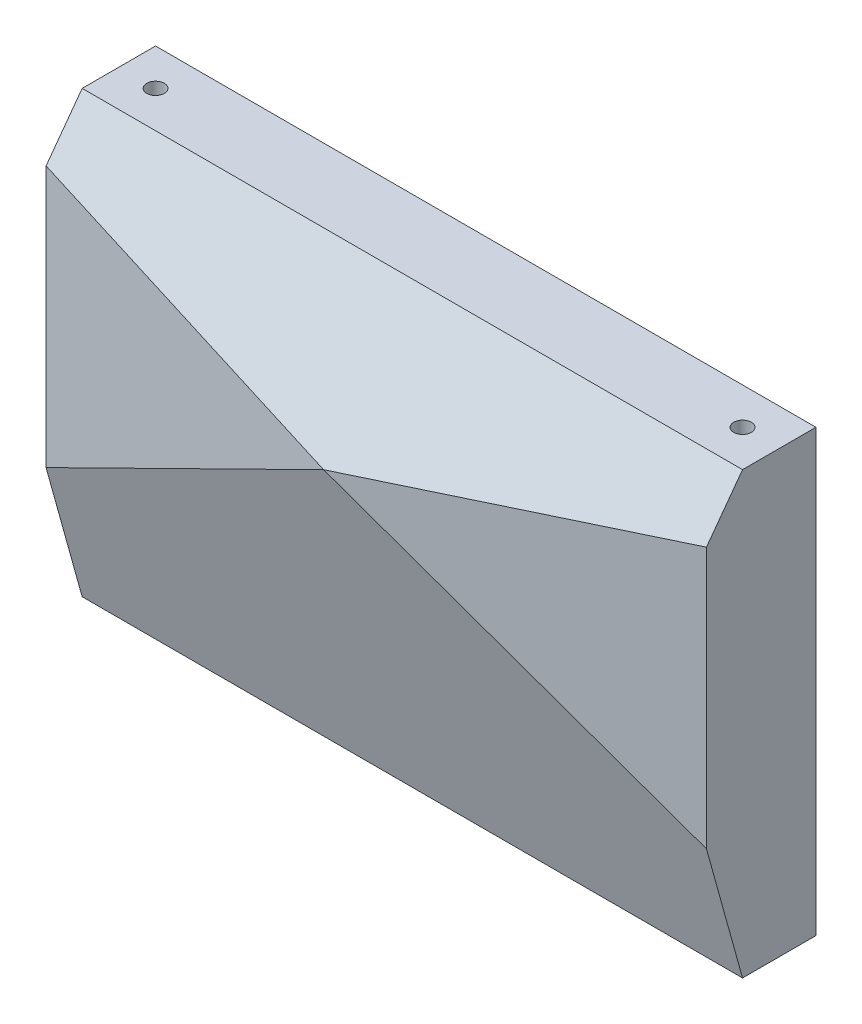
ISO-10303-21;
HEADER;
FILE_DESCRIPTION(('STEP AP214'),'2;1');
FILE_NAME('part.step','',(''),(''),'','','');
FILE_SCHEMA(('AUTOMOTIVE_DESIGN { 1 0 10303 214 1 1 1 1 }'));
ENDSEC;
DATA;
#1=APPLICATION_CONTEXT('core data for automotive mechanical design processes');
#2=APPLICATION_PROTOCOL_DEFINITION('international standard','automotive_design',2000,#1);
#3=PRODUCT_CONTEXT('',#1,'mechanical');
#4=PRODUCT('Part','Part','',(#3));
#5=PRODUCT_RELATED_PRODUCT_CATEGORY('part','',(#4));
#6=PRODUCT_DEFINITION_FORMATION('','',#4);
#7=PRODUCT_DEFINITION_CONTEXT('part definition',#1,'design');
#8=PRODUCT_DEFINITION('design','',#6,#7);
#9=PRODUCT_DEFINITION_SHAPE('','',#8);
#10=(LENGTH_UNIT() NAMED_UNIT(*) SI_UNIT(.MILLI.,.METRE.));
#11=(NAMED_UNIT(*) PLANE_ANGLE_UNIT() SI_UNIT($,.RADIAN.));
#12=(NAMED_UNIT(*) SI_UNIT($,.STERADIAN.) SOLID_ANGLE_UNIT());
#13=UNCERTAINTY_MEASURE_WITH_UNIT(LENGTH_MEASURE(1.E-05),#10,'distance_accuracy_value','');
#14=(GEOMETRIC_REPRESENTATION_CONTEXT(3) GLOBAL_UNCERTAINTY_ASSIGNED_CONTEXT((#13)) GLOBAL_UNIT_ASSIGNED_CONTEXT((#10,
#11,#12)) REPRESENTATION_CONTEXT('',''));
#15=CARTESIAN_POINT('',(0.,0.,0.));
#16=DIRECTION('',(0.,0.,1.));
#17=DIRECTION('',(1.,0.,0.));
#18=AXIS2_PLACEMENT_3D('',#15,#16,#17);
#19=CARTESIAN_POINT('',(0.,43.5423385964366,22.0969466648668));
#20=DIRECTION('',(0.,0.592254592515236,0.805750890563958));
#21=DIRECTION('',(0.,-0.805750890563958,0.592254592515236));
#22=AXIS2_PLACEMENT_3D('',#19,#20,#21);
#23=PLANE('',#22);
#24=DIRECTION('',(0.,-0.805750890563958,0.592254592515236));
#25=VECTOR('',#24,1.);
#26=CARTESIAN_POINT('',(0.,43.5423385964366,22.0969466648668));
#27=LINE('',#26,#25);
#28=CARTESIAN_POINT('',(0.,60.,10.));
#29=VERTEX_POINT('',#28);
#30=CARTESIAN_POINT('',(0.,53.3093172045236,14.9178817660506));
#31=VERTEX_POINT('',#30);
#32=EDGE_CURVE('E274',#29,#31,#27,.T.);
#33=ORIENTED_EDGE('',*,*,#32,.T.);
#34=DIRECTION('',(0.965582347232652,-0.20957382510595,0.154043963020766));
#35=VECTOR('',#34,1.);
#36=CARTESIAN_POINT('',(3.04428288207066,52.6485739648314,15.4035507522893));
#37=LINE('',#36,#35);
#38=CARTESIAN_POINT('',(45.,43.5423385964366,22.0969466648668));
#39=VERTEX_POINT('',#38);
#40=EDGE_CURVE('E74',#31,#39,#37,.T.);
#41=ORIENTED_EDGE('',*,*,#40,.T.);
#42=DIRECTION('',(0.965582347232652,0.20957382510595,-0.154043963020766));
#43=VECTOR('',#42,1.);
#44=CARTESIAN_POINT('',(3.04428288207067,34.4361032280418,28.7903425774444));
#45=LINE('',#44,#43);
#46=CARTESIAN_POINT('',(90.,53.3093172045236,14.9178817660507));
#47=VERTEX_POINT('',#46);
#48=EDGE_CURVE('E270',#39,#47,#45,.T.);
#49=ORIENTED_EDGE('',*,*,#48,.T.);
#50=DIRECTION('',(0.,-0.805750890563958,0.592254592515236));
#51=VECTOR('',#50,1.);
#52=CARTESIAN_POINT('',(90.,43.5423385964366,22.0969466648668));
#53=LINE('',#52,#51);
#54=CARTESIAN_POINT('',(90.,60.,10.));
#55=VERTEX_POINT('',#54);
#56=EDGE_CURVE('E282',#55,#47,#53,.T.);
#57=ORIENTED_EDGE('',*,*,#56,.F.);
#58=DIRECTION('',(-1.,0.,0.));
#59=VECTOR('',#58,1.);
#60=CARTESIAN_POINT('',(0.,60.,10.));
#61=LINE('',#60,#59);
#62=EDGE_CURVE('E606',#55,#29,#61,.T.);
#63=ORIENTED_EDGE('',*,*,#62,.T.);
#64=EDGE_LOOP('',(#33,#41,#49,#57,#63));
#65=FACE_BOUND('',#64,.T.);
#66=ADVANCED_FACE('F58',(#65),#23,.T.);
#67=CARTESIAN_POINT('',(0.,0.,10.));
#68=DIRECTION('',(0.,-0.267681921662446,0.963507337187995));
#69=DIRECTION('',(0.,-0.963507337187995,-0.267681921662446));
#70=AXIS2_PLACEMENT_3D('',#67,#68,#69);
#71=PLANE('',#70);
#72=DIRECTION('',(-0.859010245942676,0.493275669121898,0.13704200676379));
#73=VECTOR('',#72,1.);
#74=CARTESIAN_POINT('',(31.6687665727691,51.1976292289961,24.2237419972081));
#75=LINE('',#74,#73);
#76=CARTESIAN_POINT('',(90.,17.7016629871184,14.9178817660506));
#77=VERTEX_POINT('',#76);
#78=EDGE_CURVE('E12',#77,#39,#75,.T.);
#79=ORIENTED_EDGE('',*,*,#78,.T.);
#80=DIRECTION('',(-0.859010245942676,-0.493275669121898,-0.13704200676379));
#81=VECTOR('',#80,1.);
#82=CARTESIAN_POINT('',(-8.07964080987399,13.0620323825015,13.6288980830904));
#83=LINE('',#82,#81);
#84=CARTESIAN_POINT('',(0.,17.7016629871184,14.9178817660506));
#85=VERTEX_POINT('',#84);
#86=EDGE_CURVE('E258',#39,#85,#83,.T.);
#87=ORIENTED_EDGE('',*,*,#86,.T.);
#88=DIRECTION('',(0.,-0.963507337187995,-0.267681921662446));
#89=VECTOR('',#88,1.);
#90=CARTESIAN_POINT('',(0.,0.,10.));
#91=LINE('',#90,#89);
#92=CARTESIAN_POINT('',(0.,0.,10.));
#93=VERTEX_POINT('',#92);
#94=EDGE_CURVE('E297',#85,#93,#91,.T.);
#95=ORIENTED_EDGE('',*,*,#94,.T.);
#96=DIRECTION('',(1.,0.,0.));
#97=VECTOR('',#96,1.);
#98=CARTESIAN_POINT('',(0.,0.,10.));
#99=LINE('',#98,#97);
#100=CARTESIAN_POINT('',(90.,0.,10.));
#101=VERTEX_POINT('',#100);
#102=EDGE_CURVE('E289',#93,#101,#99,.T.);
#103=ORIENTED_EDGE('',*,*,#102,.T.);
#104=DIRECTION('',(0.,-0.963507337187995,-0.267681921662446));
#105=VECTOR('',#104,1.);
#106=CARTESIAN_POINT('',(90.,0.,10.));
#107=LINE('',#106,#105);
#108=EDGE_CURVE('E287',#77,#101,#107,.T.);
#109=ORIENTED_EDGE('',*,*,#108,.F.);
#110=EDGE_LOOP('',(#79,#87,#95,#103,#109));
#111=FACE_BOUND('',#110,.T.);
#112=ADVANCED_FACE('F285',(#111),#71,.T.);
#113=CARTESIAN_POINT('',(0.,0.,10.));
#114=DIRECTION('',(1.,0.,0.));
#115=DIRECTION('',(0.,0.,-1.));
#116=AXIS2_PLACEMENT_3D('',#113,#114,#115);
#117=PLANE('',#116);
#118=DIRECTION('',(0.,1.,0.));
#119=VECTOR('',#118,1.);
#120=CARTESIAN_POINT('',(0.,-30.0000000000001,14.9178817660506));
#121=LINE('',#120,#119);
#122=EDGE_CURVE('E260',#85,#31,#121,.T.);
#123=ORIENTED_EDGE('',*,*,#122,.T.);
#124=ORIENTED_EDGE('',*,*,#32,.F.);
#125=DIRECTION('',(0.,0.,-1.));
#126=VECTOR('',#125,1.);
#127=CARTESIAN_POINT('',(0.,60.,10.));
#128=LINE('',#127,#126);
#129=CARTESIAN_POINT('',(0.,60.,0.));
#130=VERTEX_POINT('',#129);
#131=EDGE_CURVE('E610',#29,#130,#128,.T.);
#132=ORIENTED_EDGE('',*,*,#131,.T.);
#133=DIRECTION('',(0.,-1.,0.));
#134=VECTOR('',#133,1.);
#135=CARTESIAN_POINT('',(0.,0.,0.));
#136=LINE('',#135,#134);
#137=CARTESIAN_POINT('',(0.,0.,0.));
#138=VERTEX_POINT('',#137);
#139=EDGE_CURVE('E584',#130,#138,#136,.T.);
#140=ORIENTED_EDGE('',*,*,#139,.T.);
#141=DIRECTION('',(0.,0.,-1.));
#142=VECTOR('',#141,1.);
#143=CARTESIAN_POINT('',(0.,0.,10.));
#144=LINE('',#143,#142);
#145=EDGE_CURVE('E67',#93,#138,#144,.T.);
#146=ORIENTED_EDGE('',*,*,#145,.F.);
#147=ORIENTED_EDGE('',*,*,#94,.F.);
#148=EDGE_LOOP('',(#123,#124,#132,#140,#146,#147));
#149=FACE_BOUND('',#148,.T.);
#150=ADVANCED_FACE('F60',(#149),#117,.F.);
#151=CARTESIAN_POINT('',(90.,0.,10.));
#152=DIRECTION('',(-1.,0.,0.));
#153=DIRECTION('',(0.,0.,1.));
#154=AXIS2_PLACEMENT_3D('',#151,#152,#153);
#155=PLANE('',#154);
#156=DIRECTION('',(0.,1.,0.));
#157=VECTOR('',#156,1.);
#158=CARTESIAN_POINT('',(90.,-30.0000000000001,14.9178817660506));
#159=LINE('',#158,#157);
#160=EDGE_CURVE('E276',#77,#47,#159,.T.);
#161=ORIENTED_EDGE('',*,*,#160,.F.);
#162=ORIENTED_EDGE('',*,*,#108,.T.);
#163=DIRECTION('',(0.,0.,-1.));
#164=VECTOR('',#163,1.);
#165=CARTESIAN_POINT('',(90.,0.,10.));
#166=LINE('',#165,#164);
#167=CARTESIAN_POINT('',(90.,0.,0.));
#168=VERTEX_POINT('',#167);
#169=EDGE_CURVE('E629',#101,#168,#166,.T.);
#170=ORIENTED_EDGE('',*,*,#169,.T.);
#171=DIRECTION('',(0.,1.,0.));
#172=VECTOR('',#171,1.);
#173=CARTESIAN_POINT('',(90.,0.,0.));
#174=LINE('',#173,#172);
#175=CARTESIAN_POINT('',(90.,60.,0.));
#176=VERTEX_POINT('',#175);
#177=EDGE_CURVE('E617',#168,#176,#174,.T.);
#178=ORIENTED_EDGE('',*,*,#177,.T.);
#179=DIRECTION('',(0.,0.,-1.));
#180=VECTOR('',#179,1.);
#181=CARTESIAN_POINT('',(90.,60.,10.));
#182=LINE('',#181,#180);
#183=EDGE_CURVE('E625',#55,#176,#182,.T.);
#184=ORIENTED_EDGE('',*,*,#183,.F.);
#185=ORIENTED_EDGE('',*,*,#56,.T.);
#186=EDGE_LOOP('',(#161,#162,#170,#178,#184,#185));
#187=FACE_BOUND('',#186,.T.);
#188=ADVANCED_FACE('F642',(#187),#155,.F.);
#189=CARTESIAN_POINT('',(0.,0.,10.));
#190=DIRECTION('',(0.,1.,0.));
#191=DIRECTION('',(0.,0.,1.));
#192=AXIS2_PLACEMENT_3D('',#189,#190,#191);
#193=PLANE('',#192);
#194=CARTESIAN_POINT('',(5.,0.,5.));
#195=DIRECTION('',(0.,1.,0.));
#196=DIRECTION('',(0.,0.,1.));
#197=AXIS2_PLACEMENT_3D('',#194,#195,#196);
#198=CIRCLE('',#197,1.2);
#199=CARTESIAN_POINT('',(5.,0.,6.2));
#200=VERTEX_POINT('',#199);
#201=EDGE_CURVE('E314',#200,#200,#198,.T.);
#202=ORIENTED_EDGE('',*,*,#201,.T.);
#203=EDGE_LOOP('',(#202));
#204=FACE_BOUND('',#203,.T.);
#205=CARTESIAN_POINT('',(85.,0.,5.));
#206=DIRECTION('',(0.,1.,0.));
#207=DIRECTION('',(0.,0.,1.));
#208=AXIS2_PLACEMENT_3D('',#205,#206,#207);
#209=CIRCLE('',#208,1.2);
#210=CARTESIAN_POINT('',(85.,0.,6.2));
#211=VERTEX_POINT('',#210);
#212=EDGE_CURVE('E306',#211,#211,#209,.T.);
#213=ORIENTED_EDGE('',*,*,#212,.T.);
#214=EDGE_LOOP('',(#213));
#215=FACE_BOUND('',#214,.T.);
#216=DIRECTION('',(1.,0.,0.));
#217=VECTOR('',#216,1.);
#218=CARTESIAN_POINT('',(0.,0.,0.));
#219=LINE('',#218,#217);
#220=EDGE_CURVE('E614',#138,#168,#219,.T.);
#221=ORIENTED_EDGE('',*,*,#220,.T.);
#222=ORIENTED_EDGE('',*,*,#169,.F.);
#223=ORIENTED_EDGE('',*,*,#102,.F.);
#224=ORIENTED_EDGE('',*,*,#145,.T.);
#225=EDGE_LOOP('',(#221,#222,#223,#224));
#226=FACE_BOUND('',#225,.T.);
#227=ADVANCED_FACE('F635',(#204,#215,#226),#193,.F.);
#228=CARTESIAN_POINT('',(0.,60.,10.));
#229=DIRECTION('',(0.,-1.,0.));
#230=DIRECTION('',(0.,0.,-1.));
#231=AXIS2_PLACEMENT_3D('',#228,#229,#230);
#232=PLANE('',#231);
#233=CARTESIAN_POINT('',(5.,60.,5.));
#234=DIRECTION('',(0.,1.,0.));
#235=DIRECTION('',(0.,0.,1.));
#236=AXIS2_PLACEMENT_3D('',#233,#234,#235);
#237=CIRCLE('',#236,1.2);
#238=CARTESIAN_POINT('',(5.,60.,6.2));
#239=VERTEX_POINT('',#238);
#240=EDGE_CURVE('E302',#239,#239,#237,.T.);
#241=ORIENTED_EDGE('',*,*,#240,.F.);
#242=EDGE_LOOP('',(#241));
#243=FACE_BOUND('',#242,.T.);
#244=CARTESIAN_POINT('',(85.,60.,5.));
#245=DIRECTION('',(0.,1.,0.));
#246=DIRECTION('',(0.,0.,1.));
#247=AXIS2_PLACEMENT_3D('',#244,#245,#246);
#248=CIRCLE('',#247,1.2);
#249=CARTESIAN_POINT('',(85.,60.,6.2));
#250=VERTEX_POINT('',#249);
#251=EDGE_CURVE('E307',#250,#250,#248,.T.);
#252=ORIENTED_EDGE('',*,*,#251,.F.);
#253=EDGE_LOOP('',(#252));
#254=FACE_BOUND('',#253,.T.);
#255=DIRECTION('',(-1.,0.,0.));
#256=VECTOR('',#255,1.);
#257=CARTESIAN_POINT('',(0.,60.,0.));
#258=LINE('',#257,#256);
#259=EDGE_CURVE('E607',#176,#130,#258,.T.);
#260=ORIENTED_EDGE('',*,*,#259,.T.);
#261=ORIENTED_EDGE('',*,*,#131,.F.);
#262=ORIENTED_EDGE('',*,*,#62,.F.);
#263=ORIENTED_EDGE('',*,*,#183,.T.);
#264=EDGE_LOOP('',(#260,#261,#262,#263));
#265=FACE_BOUND('',#264,.T.);
#266=ADVANCED_FACE('F645',(#243,#254,#265),#232,.F.);
#267=CARTESIAN_POINT('',(0.,0.,0.));
#268=DIRECTION('',(0.,0.,-1.));
#269=DIRECTION('',(-1.,0.,0.));
#270=AXIS2_PLACEMENT_3D('',#267,#268,#269);
#271=PLANE('',#270);
#272=CARTESIAN_POINT('',(65.7389968094098,8.00000000000001,0.));
#273=DIRECTION('',(0.,0.,1.));
#274=DIRECTION('',(-1.,0.,0.));
#275=AXIS2_PLACEMENT_3D('',#272,#273,#274);
#276=CIRCLE('',#275,2.00000000000001);
#277=CARTESIAN_POINT('',(65.7389968094098,6.,0.));
#278=VERTEX_POINT('',#277);
#279=CARTESIAN_POINT('',(66.922661010262,9.61212253244628,0.));
#280=VERTEX_POINT('',#279);
#281=EDGE_CURVE('E391',#278,#280,#276,.T.);
#282=ORIENTED_EDGE('',*,*,#281,.T.);
#283=DIRECTION('',(-0.806061266223132,0.591832100426093,0.));
#284=VECTOR('',#283,1.);
#285=CARTESIAN_POINT('',(46.1836642008522,24.8392579336471,0.));
#286=LINE('',#285,#284);
#287=CARTESIAN_POINT('',(46.1836642008522,24.8392579336471,0.));
#288=VERTEX_POINT('',#287);
#289=EDGE_CURVE('E395',#280,#288,#286,.T.);
#290=ORIENTED_EDGE('',*,*,#289,.T.);
#291=CARTESIAN_POINT('',(45.,23.2271354012009,0.));
#292=DIRECTION('',(0.,0.,1.));
#293=DIRECTION('',(-1.,0.,0.));
#294=AXIS2_PLACEMENT_3D('',#291,#292,#293);
#295=CIRCLE('',#294,2.);
#296=CARTESIAN_POINT('',(43.8163357991478,24.8392579336471,0.));
#297=VERTEX_POINT('',#296);
#298=EDGE_CURVE('E82',#288,#297,#295,.T.);
#299=ORIENTED_EDGE('',*,*,#298,.T.);
#300=DIRECTION('',(-0.806061266223132,-0.591832100426093,0.));
#301=VECTOR('',#300,1.);
#302=CARTESIAN_POINT('',(43.8163357991478,24.8392579336471,0.));
#303=LINE('',#302,#301);
#304=CARTESIAN_POINT('',(23.077338989738,9.61212253244628,0.));
#305=VERTEX_POINT('',#304);
#306=EDGE_CURVE('E402',#297,#305,#303,.T.);
#307=ORIENTED_EDGE('',*,*,#306,.T.);
#308=CARTESIAN_POINT('',(24.2610031905902,8.00000000000001,0.));
#309=DIRECTION('',(0.,0.,1.));
#310=DIRECTION('',(-1.,0.,0.));
#311=AXIS2_PLACEMENT_3D('',#308,#309,#310);
#312=CIRCLE('',#311,2.00000000000001);
#313=CARTESIAN_POINT('',(24.2610031905902,6.,0.));
#314=VERTEX_POINT('',#313);
#315=EDGE_CURVE('E406',#305,#314,#312,.T.);
#316=ORIENTED_EDGE('',*,*,#315,.T.);
#317=DIRECTION('',(1.,0.,0.));
#318=VECTOR('',#317,1.);
#319=CARTESIAN_POINT('',(24.2610031905902,6.,0.));
#320=LINE('',#319,#318);
#321=EDGE_CURVE('E410',#314,#278,#320,.T.);
#322=ORIENTED_EDGE('',*,*,#321,.T.);
#323=EDGE_LOOP('',(#282,#290,#299,#307,#316,#322));
#324=FACE_BOUND('',#323,.T.);
#325=CARTESIAN_POINT('',(65.7389968094098,52.,0.));
#326=DIRECTION('',(0.,0.,1.));
#327=DIRECTION('',(1.,0.,0.));
#328=AXIS2_PLACEMENT_3D('',#325,#326,#327);
#329=CIRCLE('',#328,2.00000000000001);
#330=CARTESIAN_POINT('',(66.922661010262,50.3878774675537,0.));
#331=VERTEX_POINT('',#330);
#332=CARTESIAN_POINT('',(65.7389968094098,54.,0.));
#333=VERTEX_POINT('',#332);
#334=EDGE_CURVE('E462',#331,#333,#329,.T.);
#335=ORIENTED_EDGE('',*,*,#334,.T.);
#336=DIRECTION('',(-1.,0.,0.));
#337=VECTOR('',#336,1.);
#338=CARTESIAN_POINT('',(24.2610031905902,54.,0.));
#339=LINE('',#338,#337);
#340=CARTESIAN_POINT('',(24.2610031905902,54.,0.));
#341=VERTEX_POINT('',#340);
#342=EDGE_CURVE('E466',#333,#341,#339,.T.);
#343=ORIENTED_EDGE('',*,*,#342,.T.);
#344=CARTESIAN_POINT('',(24.2610031905902,52.,0.));
#345=DIRECTION('',(0.,0.,1.));
#346=DIRECTION('',(-1.,0.,0.));
#347=AXIS2_PLACEMENT_3D('',#344,#345,#346);
#348=CIRCLE('',#347,1.99999999999999);
#349=CARTESIAN_POINT('',(23.077338989738,50.3878774675537,0.));
#350=VERTEX_POINT('',#349);
#351=EDGE_CURVE('E471',#341,#350,#348,.T.);
#352=ORIENTED_EDGE('',*,*,#351,.T.);
#353=DIRECTION('',(0.806061266223134,-0.591832100426091,0.));
#354=VECTOR('',#353,1.);
#355=CARTESIAN_POINT('',(43.8163357991478,35.160742066353,0.));
#356=LINE('',#355,#354);
#357=CARTESIAN_POINT('',(43.8163357991478,35.160742066353,0.));
#358=VERTEX_POINT('',#357);
#359=EDGE_CURVE('E475',#350,#358,#356,.T.);
#360=ORIENTED_EDGE('',*,*,#359,.T.);
#361=CARTESIAN_POINT('',(45.,36.7728645987991,0.));
#362=DIRECTION('',(0.,0.,1.));
#363=DIRECTION('',(1.,0.,0.));
#364=AXIS2_PLACEMENT_3D('',#361,#362,#363);
#365=CIRCLE('',#364,1.99999999999995);
#366=CARTESIAN_POINT('',(46.1836642008522,35.1607420663529,0.));
#367=VERTEX_POINT('',#366);
#368=EDGE_CURVE('E479',#358,#367,#365,.T.);
#369=ORIENTED_EDGE('',*,*,#368,.T.);
#370=DIRECTION('',(0.806061266223132,0.591832100426093,0.));
#371=VECTOR('',#370,1.);
#372=CARTESIAN_POINT('',(46.1836642008522,35.1607420663529,0.));
#373=LINE('',#372,#371);
#374=EDGE_CURVE('E483',#367,#331,#373,.T.);
#375=ORIENTED_EDGE('',*,*,#374,.T.);
#376=EDGE_LOOP('',(#335,#343,#352,#360,#369,#375));
#377=FACE_BOUND('',#376,.T.);
#378=CARTESIAN_POINT('',(39.3080932529126,30.,0.));
#379=DIRECTION('',(0.,0.,1.));
#380=DIRECTION('',(-1.,0.,0.));
#381=AXIS2_PLACEMENT_3D('',#378,#379,#380);
#382=CIRCLE('',#381,2.);
#383=CARTESIAN_POINT('',(40.4917574537647,28.3878774675537,0.));
#384=VERTEX_POINT('',#383);
#385=CARTESIAN_POINT('',(40.4917574537647,31.6121225324463,0.));
#386=VERTEX_POINT('',#385);
#387=EDGE_CURVE('E319',#384,#386,#382,.T.);
#388=ORIENTED_EDGE('',*,*,#387,.T.);
#389=DIRECTION('',(-0.80606126622313,0.591832100426096,0.));
#390=VECTOR('',#389,1.);
#391=CARTESIAN_POINT('',(13.1836642008522,51.6624671721664,0.));
#392=LINE('',#391,#390);
#393=CARTESIAN_POINT('',(13.1836642008522,51.6624671721664,0.));
#394=VERTEX_POINT('',#393);
#395=EDGE_CURVE('E323',#386,#394,#392,.T.);
#396=ORIENTED_EDGE('',*,*,#395,.T.);
#397=CARTESIAN_POINT('',(12.,50.0503446397201,0.));
#398=DIRECTION('',(0.,0.,1.));
#399=DIRECTION('',(-1.,0.,0.));
#400=AXIS2_PLACEMENT_3D('',#397,#398,#399);
#401=CIRCLE('',#400,2.);
#402=CARTESIAN_POINT('',(10.,50.0503446397201,0.));
#403=VERTEX_POINT('',#402);
#404=EDGE_CURVE('E328',#394,#403,#401,.T.);
#405=ORIENTED_EDGE('',*,*,#404,.T.);
#406=DIRECTION('',(0.,-1.,0.));
#407=VECTOR('',#406,1.);
#408=CARTESIAN_POINT('',(10.,50.0503446397201,0.));
#409=LINE('',#408,#407);
#410=CARTESIAN_POINT('',(10.,9.9496553602799,0.));
#411=VERTEX_POINT('',#410);
#412=EDGE_CURVE('E332',#403,#411,#409,.T.);
#413=ORIENTED_EDGE('',*,*,#412,.T.);
#414=CARTESIAN_POINT('',(12.,9.9496553602799,0.));
#415=DIRECTION('',(0.,0.,1.));
#416=DIRECTION('',(-1.,0.,0.));
#417=AXIS2_PLACEMENT_3D('',#414,#415,#416);
#418=CIRCLE('',#417,2.);
#419=CARTESIAN_POINT('',(13.1836642008522,8.33753282783364,0.));
#420=VERTEX_POINT('',#419);
#421=EDGE_CURVE('E336',#411,#420,#418,.T.);
#422=ORIENTED_EDGE('',*,*,#421,.T.);
#423=DIRECTION('',(0.80606126622313,0.591832100426096,0.));
#424=VECTOR('',#423,1.);
#425=CARTESIAN_POINT('',(13.1836642008522,8.33753282783364,0.));
#426=LINE('',#425,#424);
#427=EDGE_CURVE('E340',#420,#384,#426,.T.);
#428=ORIENTED_EDGE('',*,*,#427,.T.);
#429=EDGE_LOOP('',(#388,#396,#405,#413,#422,#428));
#430=FACE_BOUND('',#429,.T.);
#431=CARTESIAN_POINT('',(78.,9.94965536027991,0.));
#432=DIRECTION('',(0.,0.,1.));
#433=DIRECTION('',(-1.,0.,0.));
#434=AXIS2_PLACEMENT_3D('',#431,#432,#433);
#435=CIRCLE('',#434,2.00000000000002);
#436=CARTESIAN_POINT('',(76.8163357991478,8.33753282783363,0.));
#437=VERTEX_POINT('',#436);
#438=CARTESIAN_POINT('',(80.,9.94965536027991,0.));
#439=VERTEX_POINT('',#438);
#440=EDGE_CURVE('E532',#437,#439,#435,.T.);
#441=ORIENTED_EDGE('',*,*,#440,.T.);
#442=DIRECTION('',(0.,1.,0.));
#443=VECTOR('',#442,1.);
#444=CARTESIAN_POINT('',(80.,50.0503446397201,0.));
#445=LINE('',#444,#443);
#446=CARTESIAN_POINT('',(80.,50.0503446397201,0.));
#447=VERTEX_POINT('',#446);
#448=EDGE_CURVE('E536',#439,#447,#445,.T.);
#449=ORIENTED_EDGE('',*,*,#448,.T.);
#450=CARTESIAN_POINT('',(78.,50.0503446397201,0.));
#451=DIRECTION('',(0.,0.,1.));
#452=DIRECTION('',(1.,0.,0.));
#453=AXIS2_PLACEMENT_3D('',#450,#451,#452);
#454=CIRCLE('',#453,2.00000000000002);
#455=CARTESIAN_POINT('',(76.8163357991478,51.6624671721664,0.));
#456=VERTEX_POINT('',#455);
#457=EDGE_CURVE('E541',#447,#456,#454,.T.);
#458=ORIENTED_EDGE('',*,*,#457,.T.);
#459=DIRECTION('',(-0.80606126622313,-0.591832100426096,0.));
#460=VECTOR('',#459,1.);
#461=CARTESIAN_POINT('',(76.8163357991478,51.6624671721664,0.));
#462=LINE('',#461,#460);
#463=CARTESIAN_POINT('',(49.5082425462353,31.6121225324463,0.));
#464=VERTEX_POINT('',#463);
#465=EDGE_CURVE('E545',#456,#464,#462,.T.);
#466=ORIENTED_EDGE('',*,*,#465,.T.);
#467=CARTESIAN_POINT('',(50.6919067470875,30.,0.));
#468=DIRECTION('',(0.,0.,1.));
#469=DIRECTION('',(-1.,0.,0.));
#470=AXIS2_PLACEMENT_3D('',#467,#468,#469);
#471=CIRCLE('',#470,2.);
#472=CARTESIAN_POINT('',(49.5082425462353,28.3878774675537,0.));
#473=VERTEX_POINT('',#472);
#474=EDGE_CURVE('E549',#464,#473,#471,.T.);
#475=ORIENTED_EDGE('',*,*,#474,.T.);
#476=DIRECTION('',(0.80606126622313,-0.591832100426096,0.));
#477=VECTOR('',#476,1.);
#478=CARTESIAN_POINT('',(76.8163357991478,8.33753282783363,0.));
#479=LINE('',#478,#477);
#480=EDGE_CURVE('E553',#473,#437,#479,.T.);
#481=ORIENTED_EDGE('',*,*,#480,.T.);
#482=EDGE_LOOP('',(#441,#449,#458,#466,#475,#481));
#483=FACE_BOUND('',#482,.T.);
#484=ORIENTED_EDGE('',*,*,#139,.F.);
#485=ORIENTED_EDGE('',*,*,#259,.F.);
#486=ORIENTED_EDGE('',*,*,#177,.F.);
#487=ORIENTED_EDGE('',*,*,#220,.F.);
#488=EDGE_LOOP('',(#484,#485,#486,#487));
#489=FACE_BOUND('',#488,.T.);
#490=ADVANCED_FACE('F640',(#324,#377,#430,#483,#489),#271,.T.);
#491=CARTESIAN_POINT('',(78.,9.94965536027991,0.));
#492=DIRECTION('',(0.,0.,1.));
#493=DIRECTION('',(1.,0.,0.));
#494=AXIS2_PLACEMENT_3D('',#491,#492,#493);
#495=CYLINDRICAL_SURFACE('',#494,2.00000000000002);
#496=CARTESIAN_POINT('',(78.,9.94965536027991,10.));
#497=DIRECTION('',(0.,0.,1.));
#498=DIRECTION('',(-1.,0.,0.));
#499=AXIS2_PLACEMENT_3D('',#496,#497,#498);
#500=CIRCLE('',#499,2.00000000000002);
#501=CARTESIAN_POINT('',(76.8163357991478,8.33753282783363,10.));
#502=VERTEX_POINT('',#501);
#503=CARTESIAN_POINT('',(80.,9.94965536027991,10.));
#504=VERTEX_POINT('',#503);
#505=EDGE_CURVE('E443',#502,#504,#500,.T.);
#506=ORIENTED_EDGE('',*,*,#505,.T.);
#507=DIRECTION('',(0.,0.,1.));
#508=VECTOR('',#507,1.);
#509=CARTESIAN_POINT('',(80.,9.94965536027991,0.));
#510=LINE('',#509,#508);
#511=EDGE_CURVE('E557',#439,#504,#510,.T.);
#512=ORIENTED_EDGE('',*,*,#511,.F.);
#513=ORIENTED_EDGE('',*,*,#440,.F.);
#514=DIRECTION('',(0.,0.,1.));
#515=VECTOR('',#514,1.);
#516=CARTESIAN_POINT('',(76.8163357991478,8.33753282783363,0.));
#517=LINE('',#516,#515);
#518=EDGE_CURVE('E580',#437,#502,#517,.T.);
#519=ORIENTED_EDGE('',*,*,#518,.T.);
#520=EDGE_LOOP('',(#506,#512,#513,#519));
#521=FACE_BOUND('',#520,.T.);
#522=ADVANCED_FACE('F658',(#521),#495,.F.);
#523=CARTESIAN_POINT('',(76.8163357991478,8.33753282783363,0.));
#524=DIRECTION('',(-0.591832100426096,-0.80606126622313,0.));
#525=DIRECTION('',(0.80606126622313,-0.591832100426096,0.));
#526=AXIS2_PLACEMENT_3D('',#523,#524,#525);
#527=PLANE('',#526);
#528=DIRECTION('',(0.80606126622313,-0.591832100426096,0.));
#529=VECTOR('',#528,1.);
#530=CARTESIAN_POINT('',(76.8163357991478,8.33753282783363,10.));
#531=LINE('',#530,#529);
#532=CARTESIAN_POINT('',(49.5082425462353,28.3878774675537,10.));
#533=VERTEX_POINT('',#532);
#534=EDGE_CURVE('E537',#533,#502,#531,.T.);
#535=ORIENTED_EDGE('',*,*,#534,.T.);
#536=ORIENTED_EDGE('',*,*,#518,.F.);
#537=ORIENTED_EDGE('',*,*,#480,.F.);
#538=DIRECTION('',(0.,0.,1.));
#539=VECTOR('',#538,1.);
#540=CARTESIAN_POINT('',(49.5082425462353,28.3878774675537,0.));
#541=LINE('',#540,#539);
#542=EDGE_CURVE('E585',#473,#533,#541,.T.);
#543=ORIENTED_EDGE('',*,*,#542,.T.);
#544=EDGE_LOOP('',(#535,#536,#537,#543));
#545=FACE_BOUND('',#544,.T.);
#546=ADVANCED_FACE('F754',(#545),#527,.F.);
#547=CARTESIAN_POINT('',(50.6919067470875,30.,0.));
#548=DIRECTION('',(0.,0.,1.));
#549=DIRECTION('',(1.,0.,0.));
#550=AXIS2_PLACEMENT_3D('',#547,#548,#549);
#551=CYLINDRICAL_SURFACE('',#550,2.);
#552=CARTESIAN_POINT('',(50.6919067470875,30.,10.));
#553=DIRECTION('',(0.,0.,1.));
#554=DIRECTION('',(-1.,0.,0.));
#555=AXIS2_PLACEMENT_3D('',#552,#553,#554);
#556=CIRCLE('',#555,2.);
#557=CARTESIAN_POINT('',(49.5082425462353,31.6121225324463,10.));
#558=VERTEX_POINT('',#557);
#559=EDGE_CURVE('E573',#558,#533,#556,.T.);
#560=ORIENTED_EDGE('',*,*,#559,.T.);
#561=ORIENTED_EDGE('',*,*,#542,.F.);
#562=ORIENTED_EDGE('',*,*,#474,.F.);
#563=DIRECTION('',(0.,0.,1.));
#564=VECTOR('',#563,1.);
#565=CARTESIAN_POINT('',(49.5082425462353,31.6121225324463,0.));
#566=LINE('',#565,#564);
#567=EDGE_CURVE('E589',#464,#558,#566,.T.);
#568=ORIENTED_EDGE('',*,*,#567,.T.);
#569=EDGE_LOOP('',(#560,#561,#562,#568));
#570=FACE_BOUND('',#569,.T.);
#571=ADVANCED_FACE('F757',(#570),#551,.F.);
#572=CARTESIAN_POINT('',(76.8163357991478,51.6624671721664,0.));
#573=DIRECTION('',(-0.591832100426096,0.80606126622313,0.));
#574=DIRECTION('',(-0.80606126622313,-0.591832100426096,0.));
#575=AXIS2_PLACEMENT_3D('',#572,#573,#574);
#576=PLANE('',#575);
#577=DIRECTION('',(-0.80606126622313,-0.591832100426096,0.));
#578=VECTOR('',#577,1.);
#579=CARTESIAN_POINT('',(76.8163357991478,51.6624671721664,10.));
#580=LINE('',#579,#578);
#581=CARTESIAN_POINT('',(76.8163357991478,51.6624671721664,10.));
#582=VERTEX_POINT('',#581);
#583=EDGE_CURVE('E569',#582,#558,#580,.T.);
#584=ORIENTED_EDGE('',*,*,#583,.T.);
#585=ORIENTED_EDGE('',*,*,#567,.F.);
#586=ORIENTED_EDGE('',*,*,#465,.F.);
#587=DIRECTION('',(0.,0.,1.));
#588=VECTOR('',#587,1.);
#589=CARTESIAN_POINT('',(76.8163357991478,51.6624671721664,0.));
#590=LINE('',#589,#588);
#591=EDGE_CURVE('E593',#456,#582,#590,.T.);
#592=ORIENTED_EDGE('',*,*,#591,.T.);
#593=EDGE_LOOP('',(#584,#585,#586,#592));
#594=FACE_BOUND('',#593,.T.);
#595=ADVANCED_FACE('F761',(#594),#576,.F.);
#596=CARTESIAN_POINT('',(78.,50.0503446397201,0.));
#597=DIRECTION('',(0.,0.,1.));
#598=DIRECTION('',(1.,0.,0.));
#599=AXIS2_PLACEMENT_3D('',#596,#597,#598);
#600=CYLINDRICAL_SURFACE('',#599,2.00000000000002);
#601=CARTESIAN_POINT('',(78.,50.0503446397201,10.));
#602=DIRECTION('',(0.,0.,1.));
#603=DIRECTION('',(1.,0.,0.));
#604=AXIS2_PLACEMENT_3D('',#601,#602,#603);
#605=CIRCLE('',#604,2.00000000000002);
#606=CARTESIAN_POINT('',(80.,50.0503446397201,10.));
#607=VERTEX_POINT('',#606);
#608=EDGE_CURVE('E565',#607,#582,#605,.T.);
#609=ORIENTED_EDGE('',*,*,#608,.T.);
#610=ORIENTED_EDGE('',*,*,#591,.F.);
#611=ORIENTED_EDGE('',*,*,#457,.F.);
#612=DIRECTION('',(0.,0.,1.));
#613=VECTOR('',#612,1.);
#614=CARTESIAN_POINT('',(80.,50.0503446397201,0.));
#615=LINE('',#614,#613);
#616=EDGE_CURVE('E597',#447,#607,#615,.T.);
#617=ORIENTED_EDGE('',*,*,#616,.T.);
#618=EDGE_LOOP('',(#609,#610,#611,#617));
#619=FACE_BOUND('',#618,.T.);
#620=ADVANCED_FACE('F765',(#619),#600,.F.);
#621=CARTESIAN_POINT('',(80.,50.0503446397201,0.));
#622=DIRECTION('',(1.,0.,0.));
#623=DIRECTION('',(0.,0.,-1.));
#624=AXIS2_PLACEMENT_3D('',#621,#622,#623);
#625=PLANE('',#624);
#626=DIRECTION('',(0.,1.,0.));
#627=VECTOR('',#626,1.);
#628=CARTESIAN_POINT('',(80.,50.0503446397201,10.));
#629=LINE('',#628,#627);
#630=EDGE_CURVE('E561',#504,#607,#629,.T.);
#631=ORIENTED_EDGE('',*,*,#630,.T.);
#632=ORIENTED_EDGE('',*,*,#616,.F.);
#633=ORIENTED_EDGE('',*,*,#448,.F.);
#634=ORIENTED_EDGE('',*,*,#511,.T.);
#635=EDGE_LOOP('',(#631,#632,#633,#634));
#636=FACE_BOUND('',#635,.T.);
#637=ADVANCED_FACE('F707',(#636),#625,.F.);
#638=CARTESIAN_POINT('',(39.3080932529126,30.,0.));
#639=DIRECTION('',(0.,0.,1.));
#640=DIRECTION('',(1.,0.,0.));
#641=AXIS2_PLACEMENT_3D('',#638,#639,#640);
#642=CYLINDRICAL_SURFACE('',#641,2.);
#643=CARTESIAN_POINT('',(39.3080932529126,30.,10.));
#644=DIRECTION('',(0.,0.,1.));
#645=DIRECTION('',(-1.,0.,0.));
#646=AXIS2_PLACEMENT_3D('',#643,#644,#645);
#647=CIRCLE('',#646,2.);
#648=CARTESIAN_POINT('',(40.4917574537647,28.3878774675537,10.));
#649=VERTEX_POINT('',#648);
#650=CARTESIAN_POINT('',(40.4917574537647,31.6121225324463,10.));
#651=VERTEX_POINT('',#650);
#652=EDGE_CURVE('E318',#649,#651,#647,.T.);
#653=ORIENTED_EDGE('',*,*,#652,.T.);
#654=DIRECTION('',(0.,0.,1.));
#655=VECTOR('',#654,1.);
#656=CARTESIAN_POINT('',(40.4917574537647,31.6121225324463,0.));
#657=LINE('',#656,#655);
#658=EDGE_CURVE('E344',#386,#651,#657,.T.);
#659=ORIENTED_EDGE('',*,*,#658,.F.);
#660=ORIENTED_EDGE('',*,*,#387,.F.);
#661=DIRECTION('',(0.,0.,1.));
#662=VECTOR('',#661,1.);
#663=CARTESIAN_POINT('',(40.4917574537647,28.3878774675537,0.));
#664=LINE('',#663,#662);
#665=EDGE_CURVE('E367',#384,#649,#664,.T.);
#666=ORIENTED_EDGE('',*,*,#665,.T.);
#667=EDGE_LOOP('',(#653,#659,#660,#666));
#668=FACE_BOUND('',#667,.T.);
#669=ADVANCED_FACE('F687',(#668),#642,.F.);
#670=CARTESIAN_POINT('',(13.1836642008522,8.33753282783364,0.));
#671=DIRECTION('',(0.591832100426096,-0.80606126622313,0.));
#672=DIRECTION('',(0.80606126622313,0.591832100426096,0.));
#673=AXIS2_PLACEMENT_3D('',#670,#671,#672);
#674=PLANE('',#673);
#675=DIRECTION('',(0.80606126622313,0.591832100426096,0.));
#676=VECTOR('',#675,1.);
#677=CARTESIAN_POINT('',(13.1836642008522,8.33753282783364,10.));
#678=LINE('',#677,#676);
#679=CARTESIAN_POINT('',(13.1836642008522,8.33753282783364,10.));
#680=VERTEX_POINT('',#679);
#681=EDGE_CURVE('E324',#680,#649,#678,.T.);
#682=ORIENTED_EDGE('',*,*,#681,.T.);
#683=ORIENTED_EDGE('',*,*,#665,.F.);
#684=ORIENTED_EDGE('',*,*,#427,.F.);
#685=DIRECTION('',(0.,0.,1.));
#686=VECTOR('',#685,1.);
#687=CARTESIAN_POINT('',(13.1836642008522,8.33753282783364,0.));
#688=LINE('',#687,#686);
#689=EDGE_CURVE('E372',#420,#680,#688,.T.);
#690=ORIENTED_EDGE('',*,*,#689,.T.);
#691=EDGE_LOOP('',(#682,#683,#684,#690));
#692=FACE_BOUND('',#691,.T.);
#693=ADVANCED_FACE('F683',(#692),#674,.F.);
#694=CARTESIAN_POINT('',(12.,9.9496553602799,0.));
#695=DIRECTION('',(0.,0.,1.));
#696=DIRECTION('',(1.,0.,0.));
#697=AXIS2_PLACEMENT_3D('',#694,#695,#696);
#698=CYLINDRICAL_SURFACE('',#697,2.);
#699=CARTESIAN_POINT('',(12.,9.9496553602799,10.));
#700=DIRECTION('',(0.,0.,1.));
#701=DIRECTION('',(-1.,0.,0.));
#702=AXIS2_PLACEMENT_3D('',#699,#700,#701);
#703=CIRCLE('',#702,2.);
#704=CARTESIAN_POINT('',(10.,9.9496553602799,10.));
#705=VERTEX_POINT('',#704);
#706=EDGE_CURVE('E360',#705,#680,#703,.T.);
#707=ORIENTED_EDGE('',*,*,#706,.T.);
#708=ORIENTED_EDGE('',*,*,#689,.F.);
#709=ORIENTED_EDGE('',*,*,#421,.F.);
#710=DIRECTION('',(0.,0.,1.));
#711=VECTOR('',#710,1.);
#712=CARTESIAN_POINT('',(10.,9.9496553602799,0.));
#713=LINE('',#712,#711);
#714=EDGE_CURVE('E376',#411,#705,#713,.T.);
#715=ORIENTED_EDGE('',*,*,#714,.T.);
#716=EDGE_LOOP('',(#707,#708,#709,#715));
#717=FACE_BOUND('',#716,.T.);
#718=ADVANCED_FACE('F686',(#717),#698,.F.);
#719=CARTESIAN_POINT('',(10.,50.0503446397201,0.));
#720=DIRECTION('',(-1.,0.,0.));
#721=DIRECTION('',(0.,0.,1.));
#722=AXIS2_PLACEMENT_3D('',#719,#720,#721);
#723=PLANE('',#722);
#724=DIRECTION('',(0.,-1.,0.));
#725=VECTOR('',#724,1.);
#726=CARTESIAN_POINT('',(10.,50.0503446397201,10.));
#727=LINE('',#726,#725);
#728=CARTESIAN_POINT('',(10.,50.0503446397201,10.));
#729=VERTEX_POINT('',#728);
#730=EDGE_CURVE('E356',#729,#705,#727,.T.);
#731=ORIENTED_EDGE('',*,*,#730,.T.);
#732=ORIENTED_EDGE('',*,*,#714,.F.);
#733=ORIENTED_EDGE('',*,*,#412,.F.);
#734=DIRECTION('',(0.,0.,1.));
#735=VECTOR('',#734,1.);
#736=CARTESIAN_POINT('',(10.,50.0503446397201,0.));
#737=LINE('',#736,#735);
#738=EDGE_CURVE('E380',#403,#729,#737,.T.);
#739=ORIENTED_EDGE('',*,*,#738,.T.);
#740=EDGE_LOOP('',(#731,#732,#733,#739));
#741=FACE_BOUND('',#740,.T.);
#742=ADVANCED_FACE('F691',(#741),#723,.F.);
#743=CARTESIAN_POINT('',(12.,50.0503446397201,0.));
#744=DIRECTION('',(0.,0.,1.));
#745=DIRECTION('',(1.,0.,0.));
#746=AXIS2_PLACEMENT_3D('',#743,#744,#745);
#747=CYLINDRICAL_SURFACE('',#746,2.);
#748=CARTESIAN_POINT('',(12.,50.0503446397201,10.));
#749=DIRECTION('',(0.,0.,1.));
#750=DIRECTION('',(-1.,0.,0.));
#751=AXIS2_PLACEMENT_3D('',#748,#749,#750);
#752=CIRCLE('',#751,2.);
#753=CARTESIAN_POINT('',(13.1836642008522,51.6624671721664,10.));
#754=VERTEX_POINT('',#753);
#755=EDGE_CURVE('E352',#754,#729,#752,.T.);
#756=ORIENTED_EDGE('',*,*,#755,.T.);
#757=ORIENTED_EDGE('',*,*,#738,.F.);
#758=ORIENTED_EDGE('',*,*,#404,.F.);
#759=DIRECTION('',(0.,0.,1.));
#760=VECTOR('',#759,1.);
#761=CARTESIAN_POINT('',(13.1836642008522,51.6624671721664,0.));
#762=LINE('',#761,#760);
#763=EDGE_CURVE('E384',#394,#754,#762,.T.);
#764=ORIENTED_EDGE('',*,*,#763,.T.);
#765=EDGE_LOOP('',(#756,#757,#758,#764));
#766=FACE_BOUND('',#765,.T.);
#767=ADVANCED_FACE('F695',(#766),#747,.F.);
#768=CARTESIAN_POINT('',(13.1836642008522,51.6624671721664,0.));
#769=DIRECTION('',(0.591832100426096,0.80606126622313,0.));
#770=DIRECTION('',(-0.80606126622313,0.591832100426096,0.));
#771=AXIS2_PLACEMENT_3D('',#768,#769,#770);
#772=PLANE('',#771);
#773=DIRECTION('',(-0.80606126622313,0.591832100426096,0.));
#774=VECTOR('',#773,1.);
#775=CARTESIAN_POINT('',(13.1836642008522,51.6624671721664,10.));
#776=LINE('',#775,#774);
#777=EDGE_CURVE('E348',#651,#754,#776,.T.);
#778=ORIENTED_EDGE('',*,*,#777,.T.);
#779=ORIENTED_EDGE('',*,*,#763,.F.);
#780=ORIENTED_EDGE('',*,*,#395,.F.);
#781=ORIENTED_EDGE('',*,*,#658,.T.);
#782=EDGE_LOOP('',(#778,#779,#780,#781));
#783=FACE_BOUND('',#782,.T.);
#784=ADVANCED_FACE('F699',(#783),#772,.F.);
#785=CARTESIAN_POINT('',(65.7389968094098,52.,0.));
#786=DIRECTION('',(0.,0.,1.));
#787=DIRECTION('',(1.,0.,0.));
#788=AXIS2_PLACEMENT_3D('',#785,#786,#787);
#789=CYLINDRICAL_SURFACE('',#788,2.00000000000001);
#790=CARTESIAN_POINT('',(65.7389968094098,52.,10.));
#791=DIRECTION('',(0.,0.,1.));
#792=DIRECTION('',(1.,0.,0.));
#793=AXIS2_PLACEMENT_3D('',#790,#791,#792);
#794=CIRCLE('',#793,2.00000000000001);
#795=CARTESIAN_POINT('',(66.922661010262,50.3878774675537,10.));
#796=VERTEX_POINT('',#795);
#797=CARTESIAN_POINT('',(65.7389968094098,54.,10.));
#798=VERTEX_POINT('',#797);
#799=EDGE_CURVE('E371',#796,#798,#794,.T.);
#800=ORIENTED_EDGE('',*,*,#799,.T.);
#801=DIRECTION('',(0.,0.,1.));
#802=VECTOR('',#801,1.);
#803=CARTESIAN_POINT('',(65.7389968094098,54.,0.));
#804=LINE('',#803,#802);
#805=EDGE_CURVE('E487',#333,#798,#804,.T.);
#806=ORIENTED_EDGE('',*,*,#805,.F.);
#807=ORIENTED_EDGE('',*,*,#334,.F.);
#808=DIRECTION('',(0.,0.,1.));
#809=VECTOR('',#808,1.);
#810=CARTESIAN_POINT('',(66.922661010262,50.3878774675537,0.));
#811=LINE('',#810,#809);
#812=EDGE_CURVE('E420',#331,#796,#811,.T.);
#813=ORIENTED_EDGE('',*,*,#812,.T.);
#814=EDGE_LOOP('',(#800,#806,#807,#813));
#815=FACE_BOUND('',#814,.T.);
#816=ADVANCED_FACE('F703',(#815),#789,.F.);
#817=CARTESIAN_POINT('',(46.1836642008522,35.1607420663529,0.));
#818=DIRECTION('',(0.591832100426093,-0.806061266223132,0.));
#819=DIRECTION('',(0.806061266223132,0.591832100426093,0.));
#820=AXIS2_PLACEMENT_3D('',#817,#818,#819);
#821=PLANE('',#820);
#822=DIRECTION('',(0.806061266223132,0.591832100426093,0.));
#823=VECTOR('',#822,1.);
#824=CARTESIAN_POINT('',(46.1836642008522,35.1607420663529,10.));
#825=LINE('',#824,#823);
#826=CARTESIAN_POINT('',(46.1836642008522,35.1607420663529,10.));
#827=VERTEX_POINT('',#826);
#828=EDGE_CURVE('E467',#827,#796,#825,.T.);
#829=ORIENTED_EDGE('',*,*,#828,.T.);
#830=ORIENTED_EDGE('',*,*,#812,.F.);
#831=ORIENTED_EDGE('',*,*,#374,.F.);
#832=DIRECTION('',(0.,0.,1.));
#833=VECTOR('',#832,1.);
#834=CARTESIAN_POINT('',(46.1836642008522,35.1607420663529,0.));
#835=LINE('',#834,#833);
#836=EDGE_CURVE('E513',#367,#827,#835,.T.);
#837=ORIENTED_EDGE('',*,*,#836,.T.);
#838=EDGE_LOOP('',(#829,#830,#831,#837));
#839=FACE_BOUND('',#838,.T.);
#840=ADVANCED_FACE('F732',(#839),#821,.F.);
#841=CARTESIAN_POINT('',(45.,36.7728645987991,0.));
#842=DIRECTION('',(0.,0.,1.));
#843=DIRECTION('',(1.,0.,0.));
#844=AXIS2_PLACEMENT_3D('',#841,#842,#843);
#845=CYLINDRICAL_SURFACE('',#844,1.99999999999995);
#846=CARTESIAN_POINT('',(45.,36.7728645987991,10.));
#847=DIRECTION('',(0.,0.,1.));
#848=DIRECTION('',(1.,0.,0.));
#849=AXIS2_PLACEMENT_3D('',#846,#847,#848);
#850=CIRCLE('',#849,1.99999999999995);
#851=CARTESIAN_POINT('',(43.8163357991478,35.160742066353,10.));
#852=VERTEX_POINT('',#851);
#853=EDGE_CURVE('E503',#852,#827,#850,.T.);
#854=ORIENTED_EDGE('',*,*,#853,.T.);
#855=ORIENTED_EDGE('',*,*,#836,.F.);
#856=ORIENTED_EDGE('',*,*,#368,.F.);
#857=DIRECTION('',(0.,0.,1.));
#858=VECTOR('',#857,1.);
#859=CARTESIAN_POINT('',(43.8163357991478,35.160742066353,0.));
#860=LINE('',#859,#858);
#861=EDGE_CURVE('E517',#358,#852,#860,.T.);
#862=ORIENTED_EDGE('',*,*,#861,.T.);
#863=EDGE_LOOP('',(#854,#855,#856,#862));
#864=FACE_BOUND('',#863,.T.);
#865=ADVANCED_FACE('F735',(#864),#845,.F.);
#866=CARTESIAN_POINT('',(43.8163357991478,35.160742066353,0.));
#867=DIRECTION('',(-0.591832100426091,-0.806061266223134,0.));
#868=DIRECTION('',(0.806061266223134,-0.591832100426091,0.));
#869=AXIS2_PLACEMENT_3D('',#866,#867,#868);
#870=PLANE('',#869);
#871=DIRECTION('',(0.806061266223134,-0.591832100426091,0.));
#872=VECTOR('',#871,1.);
#873=CARTESIAN_POINT('',(43.8163357991478,35.160742066353,10.));
#874=LINE('',#873,#872);
#875=CARTESIAN_POINT('',(23.077338989738,50.3878774675537,10.));
#876=VERTEX_POINT('',#875);
#877=EDGE_CURVE('E499',#876,#852,#874,.T.);
#878=ORIENTED_EDGE('',*,*,#877,.T.);
#879=ORIENTED_EDGE('',*,*,#861,.F.);
#880=ORIENTED_EDGE('',*,*,#359,.F.);
#881=DIRECTION('',(0.,0.,1.));
#882=VECTOR('',#881,1.);
#883=CARTESIAN_POINT('',(23.077338989738,50.3878774675537,0.));
#884=LINE('',#883,#882);
#885=EDGE_CURVE('E521',#350,#876,#884,.T.);
#886=ORIENTED_EDGE('',*,*,#885,.T.);
#887=EDGE_LOOP('',(#878,#879,#880,#886));
#888=FACE_BOUND('',#887,.T.);
#889=ADVANCED_FACE('F739',(#888),#870,.F.);
#890=CARTESIAN_POINT('',(24.2610031905902,52.,0.));
#891=DIRECTION('',(0.,0.,1.));
#892=DIRECTION('',(1.,0.,0.));
#893=AXIS2_PLACEMENT_3D('',#890,#891,#892);
#894=CYLINDRICAL_SURFACE('',#893,1.99999999999999);
#895=CARTESIAN_POINT('',(24.2610031905902,52.,10.));
#896=DIRECTION('',(0.,0.,1.));
#897=DIRECTION('',(-1.,0.,0.));
#898=AXIS2_PLACEMENT_3D('',#895,#896,#897);
#899=CIRCLE('',#898,1.99999999999999);
#900=CARTESIAN_POINT('',(24.2610031905902,54.,10.));
#901=VERTEX_POINT('',#900);
#902=EDGE_CURVE('E495',#901,#876,#899,.T.);
#903=ORIENTED_EDGE('',*,*,#902,.T.);
#904=ORIENTED_EDGE('',*,*,#885,.F.);
#905=ORIENTED_EDGE('',*,*,#351,.F.);
#906=DIRECTION('',(0.,0.,1.));
#907=VECTOR('',#906,1.);
#908=CARTESIAN_POINT('',(24.2610031905902,54.,0.));
#909=LINE('',#908,#907);
#910=EDGE_CURVE('E525',#341,#901,#909,.T.);
#911=ORIENTED_EDGE('',*,*,#910,.T.);
#912=EDGE_LOOP('',(#903,#904,#905,#911));
#913=FACE_BOUND('',#912,.T.);
#914=ADVANCED_FACE('F743',(#913),#894,.F.);
#915=CARTESIAN_POINT('',(24.2610031905902,54.,0.));
#916=DIRECTION('',(0.,1.,0.));
#917=DIRECTION('',(0.,0.,1.));
#918=AXIS2_PLACEMENT_3D('',#915,#916,#917);
#919=PLANE('',#918);
#920=DIRECTION('',(-1.,0.,0.));
#921=VECTOR('',#920,1.);
#922=CARTESIAN_POINT('',(24.2610031905902,54.,10.));
#923=LINE('',#922,#921);
#924=EDGE_CURVE('E491',#798,#901,#923,.T.);
#925=ORIENTED_EDGE('',*,*,#924,.T.);
#926=ORIENTED_EDGE('',*,*,#910,.F.);
#927=ORIENTED_EDGE('',*,*,#342,.F.);
#928=ORIENTED_EDGE('',*,*,#805,.T.);
#929=EDGE_LOOP('',(#925,#926,#927,#928));
#930=FACE_BOUND('',#929,.T.);
#931=ADVANCED_FACE('F730',(#930),#919,.F.);
#932=CARTESIAN_POINT('',(65.7389968094098,8.00000000000001,0.));
#933=DIRECTION('',(0.,0.,1.));
#934=DIRECTION('',(1.,0.,0.));
#935=AXIS2_PLACEMENT_3D('',#932,#933,#934);
#936=CYLINDRICAL_SURFACE('',#935,2.00000000000001);
#937=CARTESIAN_POINT('',(65.7389968094098,8.00000000000001,10.));
#938=DIRECTION('',(0.,0.,1.));
#939=DIRECTION('',(-1.,0.,0.));
#940=AXIS2_PLACEMENT_3D('',#937,#938,#939);
#941=CIRCLE('',#940,2.00000000000001);
#942=CARTESIAN_POINT('',(65.7389968094098,6.,10.));
#943=VERTEX_POINT('',#942);
#944=CARTESIAN_POINT('',(66.922661010262,9.61212253244627,10.));
#945=VERTEX_POINT('',#944);
#946=EDGE_CURVE('E415',#943,#945,#941,.T.);
#947=ORIENTED_EDGE('',*,*,#946,.T.);
#948=DIRECTION('',(0.,0.,1.));
#949=VECTOR('',#948,1.);
#950=CARTESIAN_POINT('',(66.922661010262,9.61212253244628,0.));
#951=LINE('',#950,#949);
#952=EDGE_CURVE('E414',#280,#945,#951,.T.);
#953=ORIENTED_EDGE('',*,*,#952,.F.);
#954=ORIENTED_EDGE('',*,*,#281,.F.);
#955=DIRECTION('',(0.,0.,1.));
#956=VECTOR('',#955,1.);
#957=CARTESIAN_POINT('',(65.7389968094098,6.,0.));
#958=LINE('',#957,#956);
#959=EDGE_CURVE('E439',#278,#943,#958,.T.);
#960=ORIENTED_EDGE('',*,*,#959,.T.);
#961=EDGE_LOOP('',(#947,#953,#954,#960));
#962=FACE_BOUND('',#961,.T.);
#963=ADVANCED_FACE('F713',(#962),#936,.F.);
#964=CARTESIAN_POINT('',(24.2610031905902,6.,0.));
#965=DIRECTION('',(0.,-1.,0.));
#966=DIRECTION('',(0.,0.,-1.));
#967=AXIS2_PLACEMENT_3D('',#964,#965,#966);
#968=PLANE('',#967);
#969=DIRECTION('',(1.,0.,0.));
#970=VECTOR('',#969,1.);
#971=CARTESIAN_POINT('',(24.2610031905902,6.,10.));
#972=LINE('',#971,#970);
#973=CARTESIAN_POINT('',(24.2610031905902,6.,10.));
#974=VERTEX_POINT('',#973);
#975=EDGE_CURVE('E396',#974,#943,#972,.T.);
#976=ORIENTED_EDGE('',*,*,#975,.T.);
#977=ORIENTED_EDGE('',*,*,#959,.F.);
#978=ORIENTED_EDGE('',*,*,#321,.F.);
#979=DIRECTION('',(0.,0.,1.));
#980=VECTOR('',#979,1.);
#981=CARTESIAN_POINT('',(24.2610031905902,6.,0.));
#982=LINE('',#981,#980);
#983=EDGE_CURVE('E444',#314,#974,#982,.T.);
#984=ORIENTED_EDGE('',*,*,#983,.T.);
#985=EDGE_LOOP('',(#976,#977,#978,#984));
#986=FACE_BOUND('',#985,.T.);
#987=ADVANCED_FACE('F709',(#986),#968,.F.);
#988=CARTESIAN_POINT('',(24.2610031905902,8.00000000000001,0.));
#989=DIRECTION('',(0.,0.,1.));
#990=DIRECTION('',(1.,0.,0.));
#991=AXIS2_PLACEMENT_3D('',#988,#989,#990);
#992=CYLINDRICAL_SURFACE('',#991,2.00000000000001);
#993=CARTESIAN_POINT('',(24.2610031905902,8.00000000000001,10.));
#994=DIRECTION('',(0.,0.,1.));
#995=DIRECTION('',(-1.,0.,0.));
#996=AXIS2_PLACEMENT_3D('',#993,#994,#995);
#997=CIRCLE('',#996,2.00000000000001);
#998=CARTESIAN_POINT('',(23.077338989738,9.61212253244628,10.));
#999=VERTEX_POINT('',#998);
#1000=EDGE_CURVE('E432',#999,#974,#997,.T.);
#1001=ORIENTED_EDGE('',*,*,#1000,.T.);
#1002=ORIENTED_EDGE('',*,*,#983,.F.);
#1003=ORIENTED_EDGE('',*,*,#315,.F.);
#1004=DIRECTION('',(0.,0.,1.));
#1005=VECTOR('',#1004,1.);
#1006=CARTESIAN_POINT('',(23.077338989738,9.61212253244628,0.));
#1007=LINE('',#1006,#1005);
#1008=EDGE_CURVE('E448',#305,#999,#1007,.T.);
#1009=ORIENTED_EDGE('',*,*,#1008,.T.);
#1010=EDGE_LOOP('',(#1001,#1002,#1003,#1009));
#1011=FACE_BOUND('',#1010,.T.);
#1012=ADVANCED_FACE('F712',(#1011),#992,.F.);
#1013=CARTESIAN_POINT('',(43.8163357991478,24.8392579336471,0.));
#1014=DIRECTION('',(-0.591832100426093,0.806061266223132,0.));
#1015=DIRECTION('',(-0.806061266223132,-0.591832100426093,0.));
#1016=AXIS2_PLACEMENT_3D('',#1013,#1014,#1015);
#1017=PLANE('',#1016);
#1018=DIRECTION('',(-0.806061266223132,-0.591832100426093,0.));
#1019=VECTOR('',#1018,1.);
#1020=CARTESIAN_POINT('',(43.8163357991478,24.8392579336471,10.));
#1021=LINE('',#1020,#1019);
#1022=CARTESIAN_POINT('',(43.8163357991478,24.8392579336471,10.));
#1023=VERTEX_POINT('',#1022);
#1024=EDGE_CURVE('E428',#1023,#999,#1021,.T.);
#1025=ORIENTED_EDGE('',*,*,#1024,.T.);
#1026=ORIENTED_EDGE('',*,*,#1008,.F.);
#1027=ORIENTED_EDGE('',*,*,#306,.F.);
#1028=DIRECTION('',(0.,0.,1.));
#1029=VECTOR('',#1028,1.);
#1030=CARTESIAN_POINT('',(43.8163357991478,24.8392579336471,0.));
#1031=LINE('',#1030,#1029);
#1032=EDGE_CURVE('E452',#297,#1023,#1031,.T.);
#1033=ORIENTED_EDGE('',*,*,#1032,.T.);
#1034=EDGE_LOOP('',(#1025,#1026,#1027,#1033));
#1035=FACE_BOUND('',#1034,.T.);
#1036=ADVANCED_FACE('F717',(#1035),#1017,.F.);
#1037=CARTESIAN_POINT('',(45.,23.2271354012009,0.));
#1038=DIRECTION('',(0.,0.,1.));
#1039=DIRECTION('',(1.,0.,0.));
#1040=AXIS2_PLACEMENT_3D('',#1037,#1038,#1039);
#1041=CYLINDRICAL_SURFACE('',#1040,2.);
#1042=CARTESIAN_POINT('',(45.,23.2271354012009,10.));
#1043=DIRECTION('',(0.,0.,1.));
#1044=DIRECTION('',(-1.,0.,0.));
#1045=AXIS2_PLACEMENT_3D('',#1042,#1043,#1044);
#1046=CIRCLE('',#1045,2.);
#1047=CARTESIAN_POINT('',(46.1836642008522,24.8392579336471,10.));
#1048=VERTEX_POINT('',#1047);
#1049=EDGE_CURVE('E424',#1048,#1023,#1046,.T.);
#1050=ORIENTED_EDGE('',*,*,#1049,.T.);
#1051=ORIENTED_EDGE('',*,*,#1032,.F.);
#1052=ORIENTED_EDGE('',*,*,#298,.F.);
#1053=DIRECTION('',(0.,0.,1.));
#1054=VECTOR('',#1053,1.);
#1055=CARTESIAN_POINT('',(46.1836642008522,24.8392579336471,0.));
#1056=LINE('',#1055,#1054);
#1057=EDGE_CURVE('E456',#288,#1048,#1056,.T.);
#1058=ORIENTED_EDGE('',*,*,#1057,.T.);
#1059=EDGE_LOOP('',(#1050,#1051,#1052,#1058));
#1060=FACE_BOUND('',#1059,.T.);
#1061=ADVANCED_FACE('F721',(#1060),#1041,.F.);
#1062=CARTESIAN_POINT('',(46.1836642008522,24.8392579336471,0.));
#1063=DIRECTION('',(0.591832100426093,0.806061266223132,0.));
#1064=DIRECTION('',(-0.806061266223132,0.591832100426093,0.));
#1065=AXIS2_PLACEMENT_3D('',#1062,#1063,#1064);
#1066=PLANE('',#1065);
#1067=DIRECTION('',(-0.806061266223132,0.591832100426093,0.));
#1068=VECTOR('',#1067,1.);
#1069=CARTESIAN_POINT('',(46.1836642008522,24.8392579336471,10.));
#1070=LINE('',#1069,#1068);
#1071=EDGE_CURVE('E419',#945,#1048,#1070,.T.);
#1072=ORIENTED_EDGE('',*,*,#1071,.T.);
#1073=ORIENTED_EDGE('',*,*,#1057,.F.);
#1074=ORIENTED_EDGE('',*,*,#289,.F.);
#1075=ORIENTED_EDGE('',*,*,#952,.T.);
#1076=EDGE_LOOP('',(#1072,#1073,#1074,#1075));
#1077=FACE_BOUND('',#1076,.T.);
#1078=ADVANCED_FACE('F681',(#1077),#1066,.F.);
#1079=CARTESIAN_POINT('',(85.,-8.00000000000004,5.));
#1080=DIRECTION('',(0.,1.,0.));
#1081=DIRECTION('',(0.,0.,1.));
#1082=AXIS2_PLACEMENT_3D('',#1079,#1080,#1081);
#1083=CYLINDRICAL_SURFACE('',#1082,1.2);
#1084=ORIENTED_EDGE('',*,*,#251,.T.);
#1085=EDGE_LOOP('',(#1084));
#1086=FACE_BOUND('',#1085,.T.);
#1087=ORIENTED_EDGE('',*,*,#212,.F.);
#1088=EDGE_LOOP('',(#1087));
#1089=FACE_BOUND('',#1088,.T.);
#1090=ADVANCED_FACE('F677',(#1086,#1089),#1083,.F.);
#1091=CARTESIAN_POINT('',(5.,-8.00000000000004,5.));
#1092=DIRECTION('',(0.,1.,0.));
#1093=DIRECTION('',(0.,0.,1.));
#1094=AXIS2_PLACEMENT_3D('',#1091,#1092,#1093);
#1095=CYLINDRICAL_SURFACE('',#1094,1.2);
#1096=ORIENTED_EDGE('',*,*,#240,.T.);
#1097=EDGE_LOOP('',(#1096));
#1098=FACE_BOUND('',#1097,.T.);
#1099=ORIENTED_EDGE('',*,*,#201,.F.);
#1100=EDGE_LOOP('',(#1099));
#1101=FACE_BOUND('',#1100,.T.);
#1102=ADVANCED_FACE('F673',(#1098,#1101),#1095,.F.);
#1103=CARTESIAN_POINT('',(0.,60.,10.));
#1104=DIRECTION('',(0.,0.,-1.));
#1105=DIRECTION('',(-1.,0.,0.));
#1106=AXIS2_PLACEMENT_3D('',#1103,#1104,#1105);
#1107=PLANE('',#1106);
#1108=ORIENTED_EDGE('',*,*,#630,.F.);
#1109=ORIENTED_EDGE('',*,*,#505,.F.);
#1110=ORIENTED_EDGE('',*,*,#534,.F.);
#1111=ORIENTED_EDGE('',*,*,#559,.F.);
#1112=ORIENTED_EDGE('',*,*,#583,.F.);
#1113=ORIENTED_EDGE('',*,*,#608,.F.);
#1114=EDGE_LOOP('',(#1108,#1109,#1110,#1111,#1112,#1113));
#1115=FACE_BOUND('',#1114,.T.);
#1116=ADVANCED_FACE('F676',(#1115),#1107,.T.);
#1117=ORIENTED_EDGE('',*,*,#777,.F.);
#1118=ORIENTED_EDGE('',*,*,#652,.F.);
#1119=ORIENTED_EDGE('',*,*,#681,.F.);
#1120=ORIENTED_EDGE('',*,*,#706,.F.);
#1121=ORIENTED_EDGE('',*,*,#730,.F.);
#1122=ORIENTED_EDGE('',*,*,#755,.F.);
#1123=EDGE_LOOP('',(#1117,#1118,#1119,#1120,#1121,#1122));
#1124=FACE_BOUND('',#1123,.T.);
#1125=ADVANCED_FACE('F786',(#1124),#1107,.T.);
#1126=ORIENTED_EDGE('',*,*,#924,.F.);
#1127=ORIENTED_EDGE('',*,*,#799,.F.);
#1128=ORIENTED_EDGE('',*,*,#828,.F.);
#1129=ORIENTED_EDGE('',*,*,#853,.F.);
#1130=ORIENTED_EDGE('',*,*,#877,.F.);
#1131=ORIENTED_EDGE('',*,*,#902,.F.);
#1132=EDGE_LOOP('',(#1126,#1127,#1128,#1129,#1130,#1131));
#1133=FACE_BOUND('',#1132,.T.);
#1134=ADVANCED_FACE('F791',(#1133),#1107,.T.);
#1135=ORIENTED_EDGE('',*,*,#1071,.F.);
#1136=ORIENTED_EDGE('',*,*,#946,.F.);
#1137=ORIENTED_EDGE('',*,*,#975,.F.);
#1138=ORIENTED_EDGE('',*,*,#1000,.F.);
#1139=ORIENTED_EDGE('',*,*,#1024,.F.);
#1140=ORIENTED_EDGE('',*,*,#1049,.F.);
#1141=EDGE_LOOP('',(#1135,#1136,#1137,#1138,#1139,#1140));
#1142=FACE_BOUND('',#1141,.T.);
#1143=ADVANCED_FACE('F787',(#1142),#1107,.T.);
#1144=CARTESIAN_POINT('',(4.55462071192787,-30.0000000000001,28.5493911707848));
#1145=DIRECTION('',(0.157542537461604,0.,0.987512201894315));
#1146=DIRECTION('',(0.987512201894316,0.,-0.157542537461604));
#1147=AXIS2_PLACEMENT_3D('',#1144,#1145,#1146);
#1148=PLANE('',#1147);
#1149=ORIENTED_EDGE('',*,*,#78,.F.);
#1150=ORIENTED_EDGE('',*,*,#160,.T.);
#1151=ORIENTED_EDGE('',*,*,#48,.F.);
#1152=EDGE_LOOP('',(#1149,#1150,#1151));
#1153=FACE_BOUND('',#1152,.T.);
#1154=ADVANCED_FACE('F279',(#1153),#1148,.T.);
#1155=CARTESIAN_POINT('',(-2.32085211204219,-30.0000000000001,14.5476251453194));
#1156=DIRECTION('',(-0.157542537461604,0.,0.987512201894315));
#1157=DIRECTION('',(0.987512201894316,0.,0.157542537461604));
#1158=AXIS2_PLACEMENT_3D('',#1155,#1156,#1157);
#1159=PLANE('',#1158);
#1160=ORIENTED_EDGE('',*,*,#122,.F.);
#1161=ORIENTED_EDGE('',*,*,#86,.F.);
#1162=ORIENTED_EDGE('',*,*,#40,.F.);
#1163=EDGE_LOOP('',(#1160,#1161,#1162));
#1164=FACE_BOUND('',#1163,.T.);
#1165=ADVANCED_FACE('F259',(#1164),#1159,.T.);
#1166=CLOSED_SHELL('',(#66,#112,#150,#188,#227,#266,#490,#522,#546,#571,#595,#620,#637,#669,
#693,#718,#742,#767,#784,#816,#840,#865,#889,#914,#931,#963,#987,#1012,#1036,#1061,#1078,#1090,
#1102,#1116,#1125,#1134,#1143,#1154,#1165));
#1167=MANIFOLD_SOLID_BREP('B2',#1166);
#1168=ADVANCED_BREP_SHAPE_REPRESENTATION('',(#18,#1167),#14);
#1169=SHAPE_DEFINITION_REPRESENTATION(#9,#1168);
ENDSEC;
END-ISO-10303-21;
